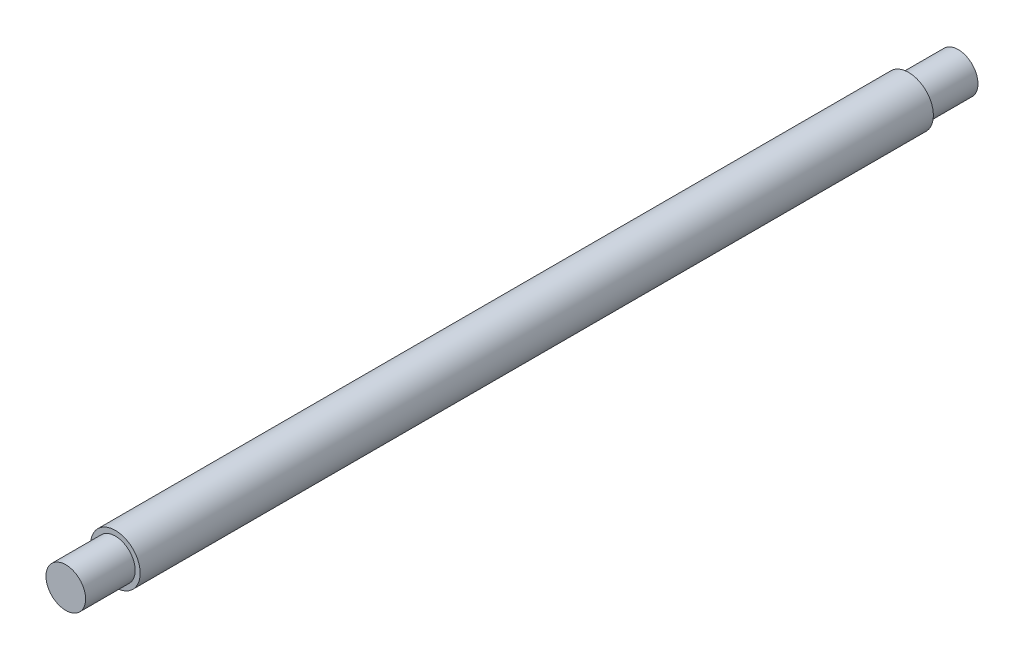
ISO-10303-21;
HEADER;
FILE_DESCRIPTION(('STEP AP214'),'2;1');
FILE_NAME('part.step','',(''),(''),'','','');
FILE_SCHEMA(('AUTOMOTIVE_DESIGN { 1 0 10303 214 1 1 1 1 }'));
ENDSEC;
DATA;
#1=APPLICATION_CONTEXT('core data for automotive mechanical design processes');
#2=APPLICATION_PROTOCOL_DEFINITION('international standard','automotive_design',2000,#1);
#3=PRODUCT_CONTEXT('',#1,'mechanical');
#4=PRODUCT('Part','Part','',(#3));
#5=PRODUCT_RELATED_PRODUCT_CATEGORY('part','',(#4));
#6=PRODUCT_DEFINITION_FORMATION('','',#4);
#7=PRODUCT_DEFINITION_CONTEXT('part definition',#1,'design');
#8=PRODUCT_DEFINITION('design','',#6,#7);
#9=PRODUCT_DEFINITION_SHAPE('','',#8);
#10=(LENGTH_UNIT() NAMED_UNIT(*) SI_UNIT(.MILLI.,.METRE.));
#11=(NAMED_UNIT(*) PLANE_ANGLE_UNIT() SI_UNIT($,.RADIAN.));
#12=(NAMED_UNIT(*) SI_UNIT($,.STERADIAN.) SOLID_ANGLE_UNIT());
#13=UNCERTAINTY_MEASURE_WITH_UNIT(LENGTH_MEASURE(1.E-05),#10,'distance_accuracy_value','');
#14=(GEOMETRIC_REPRESENTATION_CONTEXT(3) GLOBAL_UNCERTAINTY_ASSIGNED_CONTEXT((#13)) GLOBAL_UNIT_ASSIGNED_CONTEXT((#10,
#11,#12)) REPRESENTATION_CONTEXT('',''));
#15=CARTESIAN_POINT('',(0.,0.,0.));
#16=DIRECTION('',(0.,0.,1.));
#17=DIRECTION('',(1.,0.,0.));
#18=AXIS2_PLACEMENT_3D('',#15,#16,#17);
#19=CARTESIAN_POINT('',(-0.640184399664479,5.28152129723195,80.));
#20=DIRECTION('',(0.,0.,-1.));
#21=DIRECTION('',(-1.,0.,0.));
#22=AXIS2_PLACEMENT_3D('',#19,#20,#21);
#23=CYLINDRICAL_SURFACE('',#22,2.5);
#24=CARTESIAN_POINT('',(-0.640184399664479,5.28152129723195,80.));
#25=DIRECTION('',(0.,0.,1.));
#26=DIRECTION('',(1.,0.,0.));
#27=AXIS2_PLACEMENT_3D('',#24,#25,#26);
#28=CIRCLE('',#27,2.5);
#29=CARTESIAN_POINT('',(1.85981560033552,5.28152129723195,80.));
#30=VERTEX_POINT('',#29);
#31=EDGE_CURVE('E41',#30,#30,#28,.T.);
#32=ORIENTED_EDGE('',*,*,#31,.F.);
#33=EDGE_LOOP('',(#32));
#34=FACE_BOUND('',#33,.T.);
#35=CARTESIAN_POINT('',(-0.640184399664479,5.28152129723195,0.));
#36=DIRECTION('',(0.,0.,1.));
#37=DIRECTION('',(1.,0.,0.));
#38=AXIS2_PLACEMENT_3D('',#35,#36,#37);
#39=CIRCLE('',#38,2.5);
#40=CARTESIAN_POINT('',(1.85981560033552,5.28152129723195,0.));
#41=VERTEX_POINT('',#40);
#42=EDGE_CURVE('E45',#41,#41,#39,.T.);
#43=ORIENTED_EDGE('',*,*,#42,.T.);
#44=EDGE_LOOP('',(#43));
#45=FACE_BOUND('',#44,.T.);
#46=ADVANCED_FACE('F35',(#34,#45),#23,.T.);
#47=CARTESIAN_POINT('',(-0.640184399664479,5.28152129723195,80.));
#48=DIRECTION('',(0.,0.,1.));
#49=DIRECTION('',(1.,0.,0.));
#50=AXIS2_PLACEMENT_3D('',#47,#48,#49);
#51=PLANE('',#50);
#52=CARTESIAN_POINT('',(-0.640184399664479,5.28152129723195,80.));
#53=DIRECTION('',(0.,0.,1.));
#54=DIRECTION('',(1.,0.,0.));
#55=AXIS2_PLACEMENT_3D('',#52,#53,#54);
#56=CIRCLE('',#55,2.);
#57=CARTESIAN_POINT('',(1.35981560033552,5.28152129723195,80.));
#58=VERTEX_POINT('',#57);
#59=EDGE_CURVE('E52',#58,#58,#56,.T.);
#60=ORIENTED_EDGE('',*,*,#59,.F.);
#61=EDGE_LOOP('',(#60));
#62=FACE_BOUND('',#61,.T.);
#63=ORIENTED_EDGE('',*,*,#31,.T.);
#64=EDGE_LOOP('',(#63));
#65=FACE_BOUND('',#64,.T.);
#66=ADVANCED_FACE('F76',(#62,#65),#51,.T.);
#67=CARTESIAN_POINT('',(-0.640184399664479,5.28152129723195,0.));
#68=DIRECTION('',(0.,0.,1.));
#69=DIRECTION('',(1.,0.,0.));
#70=AXIS2_PLACEMENT_3D('',#67,#68,#69);
#71=PLANE('',#70);
#72=CARTESIAN_POINT('',(-0.640184399664479,5.28152129723195,0.));
#73=DIRECTION('',(0.,0.,1.));
#74=DIRECTION('',(1.,0.,0.));
#75=AXIS2_PLACEMENT_3D('',#72,#73,#74);
#76=CIRCLE('',#75,2.);
#77=CARTESIAN_POINT('',(1.35981560033552,5.28152129723195,0.));
#78=VERTEX_POINT('',#77);
#79=EDGE_CURVE('E10',#78,#78,#76,.F.);
#80=ORIENTED_EDGE('',*,*,#79,.F.);
#81=EDGE_LOOP('',(#80));
#82=FACE_BOUND('',#81,.T.);
#83=ORIENTED_EDGE('',*,*,#42,.F.);
#84=EDGE_LOOP('',(#83));
#85=FACE_BOUND('',#84,.T.);
#86=ADVANCED_FACE('F81',(#82,#85),#71,.F.);
#87=CARTESIAN_POINT('',(-0.640184399664479,5.28152129723195,85.));
#88=DIRECTION('',(0.,0.,-1.));
#89=DIRECTION('',(-1.,0.,0.));
#90=AXIS2_PLACEMENT_3D('',#87,#88,#89);
#91=CYLINDRICAL_SURFACE('',#90,2.);
#92=CARTESIAN_POINT('',(-0.640184399664479,5.28152129723195,85.));
#93=DIRECTION('',(0.,0.,1.));
#94=DIRECTION('',(1.,0.,0.));
#95=AXIS2_PLACEMENT_3D('',#92,#93,#94);
#96=CIRCLE('',#95,2.);
#97=CARTESIAN_POINT('',(1.35981560033552,5.28152129723195,85.));
#98=VERTEX_POINT('',#97);
#99=EDGE_CURVE('E50',#98,#98,#96,.T.);
#100=ORIENTED_EDGE('',*,*,#99,.F.);
#101=EDGE_LOOP('',(#100));
#102=FACE_BOUND('',#101,.T.);
#103=ORIENTED_EDGE('',*,*,#59,.T.);
#104=EDGE_LOOP('',(#103));
#105=FACE_BOUND('',#104,.T.);
#106=ADVANCED_FACE('F72',(#102,#105),#91,.T.);
#107=CARTESIAN_POINT('',(-0.640184399664479,5.28152129723195,85.));
#108=DIRECTION('',(0.,0.,1.));
#109=DIRECTION('',(1.,0.,0.));
#110=AXIS2_PLACEMENT_3D('',#107,#108,#109);
#111=PLANE('',#110);
#112=ORIENTED_EDGE('',*,*,#99,.T.);
#113=EDGE_LOOP('',(#112));
#114=FACE_BOUND('',#113,.T.);
#115=ADVANCED_FACE('F65',(#114),#111,.T.);
#116=CARTESIAN_POINT('',(-0.640184399664479,5.28152129723195,-5.));
#117=DIRECTION('',(0.,0.,1.));
#118=DIRECTION('',(1.,0.,0.));
#119=AXIS2_PLACEMENT_3D('',#116,#117,#118);
#120=CYLINDRICAL_SURFACE('',#119,2.);
#121=CARTESIAN_POINT('',(-0.640184399664479,5.28152129723195,-5.));
#122=DIRECTION('',(0.,0.,-1.));
#123=DIRECTION('',(-1.,0.,0.));
#124=AXIS2_PLACEMENT_3D('',#121,#122,#123);
#125=CIRCLE('',#124,2.);
#126=CARTESIAN_POINT('',(-2.64018439966448,5.28152129723195,-5.));
#127=VERTEX_POINT('',#126);
#128=EDGE_CURVE('E55',#127,#127,#125,.T.);
#129=ORIENTED_EDGE('',*,*,#128,.F.);
#130=EDGE_LOOP('',(#129));
#131=FACE_BOUND('',#130,.T.);
#132=ORIENTED_EDGE('',*,*,#79,.T.);
#133=EDGE_LOOP('',(#132));
#134=FACE_BOUND('',#133,.T.);
#135=ADVANCED_FACE('F63',(#131,#134),#120,.T.);
#136=CARTESIAN_POINT('',(-0.640184399664479,5.28152129723195,-5.));
#137=DIRECTION('',(0.,0.,-1.));
#138=DIRECTION('',(-1.,0.,0.));
#139=AXIS2_PLACEMENT_3D('',#136,#137,#138);
#140=PLANE('',#139);
#141=ORIENTED_EDGE('',*,*,#128,.T.);
#142=EDGE_LOOP('',(#141));
#143=FACE_BOUND('',#142,.T.);
#144=ADVANCED_FACE('F61',(#143),#140,.T.);
#145=CLOSED_SHELL('',(#46,#66,#86,#106,#115,#135,#144));
#146=MANIFOLD_SOLID_BREP('B2',#145);
#147=ADVANCED_BREP_SHAPE_REPRESENTATION('',(#18,#146),#14);
#148=SHAPE_DEFINITION_REPRESENTATION(#9,#147);
ENDSEC;
END-ISO-10303-21;
